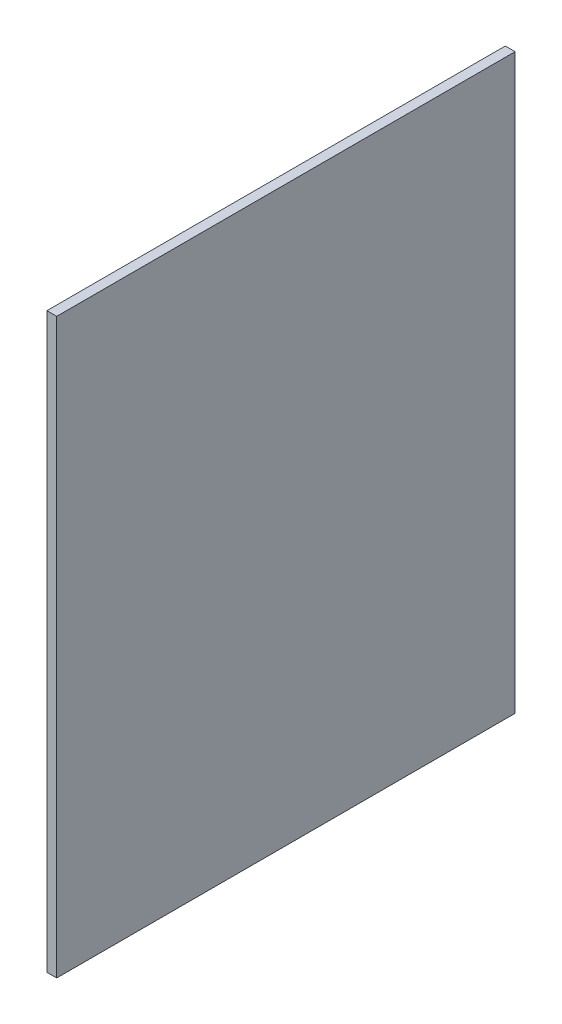
ISO-10303-21;
HEADER;
FILE_DESCRIPTION(('STEP AP214'),'2;1');
FILE_NAME('part.step','',(''),(''),'','','');
FILE_SCHEMA(('AUTOMOTIVE_DESIGN { 1 0 10303 214 1 1 1 1 }'));
ENDSEC;
DATA;
#1=APPLICATION_CONTEXT('core data for automotive mechanical design processes');
#2=APPLICATION_PROTOCOL_DEFINITION('international standard','automotive_design',2000,#1);
#3=PRODUCT_CONTEXT('',#1,'mechanical');
#4=PRODUCT('Part','Part','',(#3));
#5=PRODUCT_RELATED_PRODUCT_CATEGORY('part','',(#4));
#6=PRODUCT_DEFINITION_FORMATION('','',#4);
#7=PRODUCT_DEFINITION_CONTEXT('part definition',#1,'design');
#8=PRODUCT_DEFINITION('design','',#6,#7);
#9=PRODUCT_DEFINITION_SHAPE('','',#8);
#10=(LENGTH_UNIT() NAMED_UNIT(*) SI_UNIT(.MILLI.,.METRE.));
#11=(NAMED_UNIT(*) PLANE_ANGLE_UNIT() SI_UNIT($,.RADIAN.));
#12=(NAMED_UNIT(*) SI_UNIT($,.STERADIAN.) SOLID_ANGLE_UNIT());
#13=UNCERTAINTY_MEASURE_WITH_UNIT(LENGTH_MEASURE(1.E-05),#10,'distance_accuracy_value','');
#14=(GEOMETRIC_REPRESENTATION_CONTEXT(3) GLOBAL_UNCERTAINTY_ASSIGNED_CONTEXT((#13)) GLOBAL_UNIT_ASSIGNED_CONTEXT((#10,
#11,#12)) REPRESENTATION_CONTEXT('',''));
#15=CARTESIAN_POINT('',(0.,0.,0.));
#16=DIRECTION('',(0.,0.,1.));
#17=DIRECTION('',(1.,0.,0.));
#18=AXIS2_PLACEMENT_3D('',#15,#16,#17);
#19=CARTESIAN_POINT('',(0.,0.,0.));
#20=DIRECTION('',(1.,0.,0.));
#21=DIRECTION('',(0.,1.,0.));
#22=AXIS2_PLACEMENT_3D('',#19,#20,#21);
#23=PLANE('',#22);
#24=DIRECTION('',(0.,0.,-1.));
#25=VECTOR('',#24,1.);
#26=CARTESIAN_POINT('',(0.,-87.5,70.));
#27=LINE('',#26,#25);
#28=CARTESIAN_POINT('',(0.,-87.5,70.));
#29=VERTEX_POINT('',#28);
#30=CARTESIAN_POINT('',(0.,-87.5,-70.));
#31=VERTEX_POINT('',#30);
#32=EDGE_CURVE('E27',#29,#31,#27,.T.);
#33=ORIENTED_EDGE('',*,*,#32,.F.);
#34=DIRECTION('',(0.,-1.,0.));
#35=VECTOR('',#34,1.);
#36=CARTESIAN_POINT('',(0.,87.5,70.));
#37=LINE('',#36,#35);
#38=CARTESIAN_POINT('',(0.,87.5,70.));
#39=VERTEX_POINT('',#38);
#40=EDGE_CURVE('E89',#39,#29,#37,.T.);
#41=ORIENTED_EDGE('',*,*,#40,.F.);
#42=DIRECTION('',(0.,0.,1.));
#43=VECTOR('',#42,1.);
#44=CARTESIAN_POINT('',(0.,87.5,-70.));
#45=LINE('',#44,#43);
#46=CARTESIAN_POINT('',(0.,87.5,-70.));
#47=VERTEX_POINT('',#46);
#48=EDGE_CURVE('E71',#47,#39,#45,.T.);
#49=ORIENTED_EDGE('',*,*,#48,.F.);
#50=DIRECTION('',(0.,1.,0.));
#51=VECTOR('',#50,1.);
#52=CARTESIAN_POINT('',(0.,-87.5,-70.));
#53=LINE('',#52,#51);
#54=EDGE_CURVE('E106',#31,#47,#53,.T.);
#55=ORIENTED_EDGE('',*,*,#54,.F.);
#56=EDGE_LOOP('',(#33,#41,#49,#55));
#57=FACE_BOUND('',#56,.T.);
#58=ADVANCED_FACE('F17',(#57),#23,.F.);
#59=CARTESIAN_POINT('',(3.,0.,0.));
#60=DIRECTION('',(1.,0.,0.));
#61=DIRECTION('',(0.,1.,0.));
#62=AXIS2_PLACEMENT_3D('',#59,#60,#61);
#63=PLANE('',#62);
#64=DIRECTION('',(0.,0.,-1.));
#65=VECTOR('',#64,1.);
#66=CARTESIAN_POINT('',(3.,-87.5,70.));
#67=LINE('',#66,#65);
#68=CARTESIAN_POINT('',(3.,-87.5,70.));
#69=VERTEX_POINT('',#68);
#70=CARTESIAN_POINT('',(3.,-87.5,-70.));
#71=VERTEX_POINT('',#70);
#72=EDGE_CURVE('E11',#69,#71,#67,.T.);
#73=ORIENTED_EDGE('',*,*,#72,.T.);
#74=DIRECTION('',(0.,1.,0.));
#75=VECTOR('',#74,1.);
#76=CARTESIAN_POINT('',(3.,-87.5,-70.));
#77=LINE('',#76,#75);
#78=CARTESIAN_POINT('',(3.,87.5,-70.));
#79=VERTEX_POINT('',#78);
#80=EDGE_CURVE('E114',#71,#79,#77,.T.);
#81=ORIENTED_EDGE('',*,*,#80,.T.);
#82=DIRECTION('',(0.,0.,1.));
#83=VECTOR('',#82,1.);
#84=CARTESIAN_POINT('',(3.,87.5,-70.));
#85=LINE('',#84,#83);
#86=CARTESIAN_POINT('',(3.,87.5,70.));
#87=VERTEX_POINT('',#86);
#88=EDGE_CURVE('E82',#79,#87,#85,.T.);
#89=ORIENTED_EDGE('',*,*,#88,.T.);
#90=DIRECTION('',(0.,-1.,0.));
#91=VECTOR('',#90,1.);
#92=CARTESIAN_POINT('',(3.,87.5,70.));
#93=LINE('',#92,#91);
#94=EDGE_CURVE('E93',#87,#69,#93,.T.);
#95=ORIENTED_EDGE('',*,*,#94,.T.);
#96=EDGE_LOOP('',(#73,#81,#89,#95));
#97=FACE_BOUND('',#96,.T.);
#98=ADVANCED_FACE('F122',(#97),#63,.T.);
#99=CARTESIAN_POINT('',(0.,-87.5,70.));
#100=DIRECTION('',(0.,-1.,0.));
#101=DIRECTION('',(0.,0.,-1.));
#102=AXIS2_PLACEMENT_3D('',#99,#100,#101);
#103=PLANE('',#102);
#104=ORIENTED_EDGE('',*,*,#32,.T.);
#105=DIRECTION('',(1.,0.,0.));
#106=VECTOR('',#105,1.);
#107=CARTESIAN_POINT('',(0.,-87.5,-70.));
#108=LINE('',#107,#106);
#109=EDGE_CURVE('E20',#31,#71,#108,.T.);
#110=ORIENTED_EDGE('',*,*,#109,.T.);
#111=ORIENTED_EDGE('',*,*,#72,.F.);
#112=DIRECTION('',(1.,0.,0.));
#113=VECTOR('',#112,1.);
#114=CARTESIAN_POINT('',(0.,-87.5,70.));
#115=LINE('',#114,#113);
#116=EDGE_CURVE('E92',#29,#69,#115,.T.);
#117=ORIENTED_EDGE('',*,*,#116,.F.);
#118=EDGE_LOOP('',(#104,#110,#111,#117));
#119=FACE_BOUND('',#118,.T.);
#120=ADVANCED_FACE('F121',(#119),#103,.T.);
#121=CARTESIAN_POINT('',(0.,-87.5,-70.));
#122=DIRECTION('',(0.,0.,-1.));
#123=DIRECTION('',(0.,-1.,0.));
#124=AXIS2_PLACEMENT_3D('',#121,#122,#123);
#125=PLANE('',#124);
#126=ORIENTED_EDGE('',*,*,#54,.T.);
#127=DIRECTION('',(1.,0.,0.));
#128=VECTOR('',#127,1.);
#129=CARTESIAN_POINT('',(0.,87.5,-70.));
#130=LINE('',#129,#128);
#131=EDGE_CURVE('E78',#47,#79,#130,.T.);
#132=ORIENTED_EDGE('',*,*,#131,.T.);
#133=ORIENTED_EDGE('',*,*,#80,.F.);
#134=ORIENTED_EDGE('',*,*,#109,.F.);
#135=EDGE_LOOP('',(#126,#132,#133,#134));
#136=FACE_BOUND('',#135,.T.);
#137=ADVANCED_FACE('F123',(#136),#125,.T.);
#138=CARTESIAN_POINT('',(0.,87.5,-70.));
#139=DIRECTION('',(0.,1.,0.));
#140=DIRECTION('',(0.,0.,-1.));
#141=AXIS2_PLACEMENT_3D('',#138,#139,#140);
#142=PLANE('',#141);
#143=ORIENTED_EDGE('',*,*,#48,.T.);
#144=DIRECTION('',(1.,0.,0.));
#145=VECTOR('',#144,1.);
#146=CARTESIAN_POINT('',(0.,87.5,70.));
#147=LINE('',#146,#145);
#148=EDGE_CURVE('E76',#39,#87,#147,.T.);
#149=ORIENTED_EDGE('',*,*,#148,.T.);
#150=ORIENTED_EDGE('',*,*,#88,.F.);
#151=ORIENTED_EDGE('',*,*,#131,.F.);
#152=EDGE_LOOP('',(#143,#149,#150,#151));
#153=FACE_BOUND('',#152,.T.);
#154=ADVANCED_FACE('F72',(#153),#142,.T.);
#155=CARTESIAN_POINT('',(0.,87.5,70.));
#156=DIRECTION('',(0.,0.,1.));
#157=DIRECTION('',(0.,-1.,0.));
#158=AXIS2_PLACEMENT_3D('',#155,#156,#157);
#159=PLANE('',#158);
#160=ORIENTED_EDGE('',*,*,#40,.T.);
#161=ORIENTED_EDGE('',*,*,#116,.T.);
#162=ORIENTED_EDGE('',*,*,#94,.F.);
#163=ORIENTED_EDGE('',*,*,#148,.F.);
#164=EDGE_LOOP('',(#160,#161,#162,#163));
#165=FACE_BOUND('',#164,.T.);
#166=ADVANCED_FACE('F86',(#165),#159,.T.);
#167=CLOSED_SHELL('',(#58,#98,#120,#137,#154,#166));
#168=MANIFOLD_SOLID_BREP('B1',#167);
#169=ADVANCED_BREP_SHAPE_REPRESENTATION('',(#18,#168),#14);
#170=SHAPE_DEFINITION_REPRESENTATION(#9,#169);
ENDSEC;
END-ISO-10303-21;
